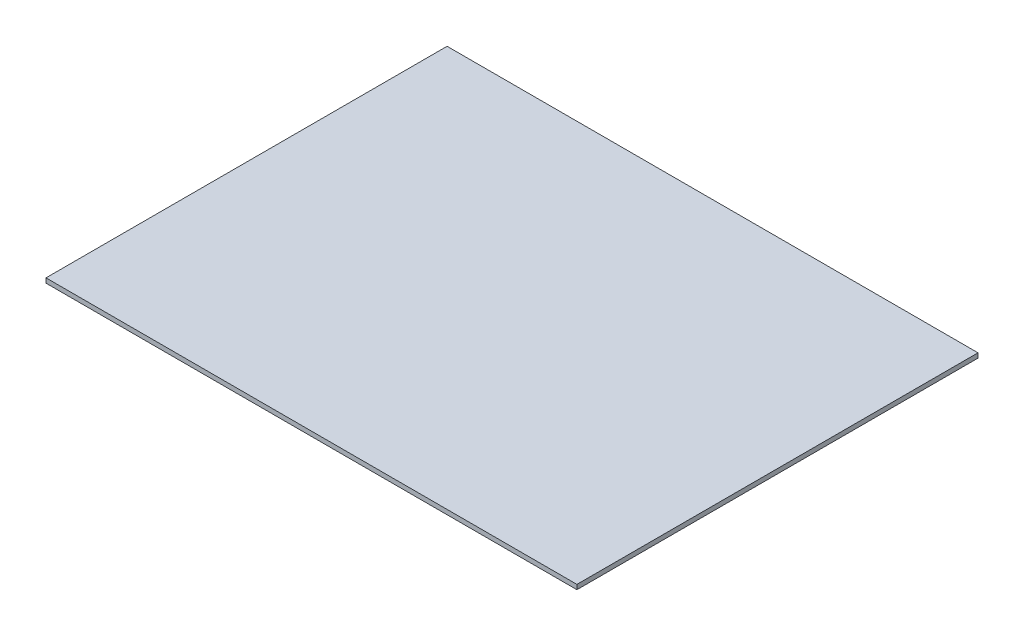
ISO-10303-21;
HEADER;
FILE_DESCRIPTION(('STEP AP214'),'2;1');
FILE_NAME('part.step','',(''),(''),'','','');
FILE_SCHEMA(('AUTOMOTIVE_DESIGN { 1 0 10303 214 1 1 1 1 }'));
ENDSEC;
DATA;
#1=APPLICATION_CONTEXT('core data for automotive mechanical design processes');
#2=APPLICATION_PROTOCOL_DEFINITION('international standard','automotive_design',2000,#1);
#3=PRODUCT_CONTEXT('',#1,'mechanical');
#4=PRODUCT('Part','Part','',(#3));
#5=PRODUCT_RELATED_PRODUCT_CATEGORY('part','',(#4));
#6=PRODUCT_DEFINITION_FORMATION('','',#4);
#7=PRODUCT_DEFINITION_CONTEXT('part definition',#1,'design');
#8=PRODUCT_DEFINITION('design','',#6,#7);
#9=PRODUCT_DEFINITION_SHAPE('','',#8);
#10=(LENGTH_UNIT() NAMED_UNIT(*) SI_UNIT(.MILLI.,.METRE.));
#11=(NAMED_UNIT(*) PLANE_ANGLE_UNIT() SI_UNIT($,.RADIAN.));
#12=(NAMED_UNIT(*) SI_UNIT($,.STERADIAN.) SOLID_ANGLE_UNIT());
#13=UNCERTAINTY_MEASURE_WITH_UNIT(LENGTH_MEASURE(1.E-05),#10,'distance_accuracy_value','');
#14=(GEOMETRIC_REPRESENTATION_CONTEXT(3) GLOBAL_UNCERTAINTY_ASSIGNED_CONTEXT((#13)) GLOBAL_UNIT_ASSIGNED_CONTEXT((#10,
#11,#12)) REPRESENTATION_CONTEXT('',''));
#15=CARTESIAN_POINT('',(0.,0.,0.));
#16=DIRECTION('',(0.,0.,1.));
#17=DIRECTION('',(1.,0.,0.));
#18=AXIS2_PLACEMENT_3D('',#15,#16,#17);
#19=CARTESIAN_POINT('',(0.,2.,0.));
#20=DIRECTION('',(1.,0.,0.));
#21=DIRECTION('',(0.,0.,-1.));
#22=AXIS2_PLACEMENT_3D('',#19,#20,#21);
#23=PLANE('',#22);
#24=DIRECTION('',(0.,0.,1.));
#25=VECTOR('',#24,1.);
#26=CARTESIAN_POINT('',(0.,0.,0.));
#27=LINE('',#26,#25);
#28=CARTESIAN_POINT('',(0.,0.,-173.));
#29=VERTEX_POINT('',#28);
#30=CARTESIAN_POINT('',(0.,0.,0.));
#31=VERTEX_POINT('',#30);
#32=EDGE_CURVE('E107',#29,#31,#27,.T.);
#33=ORIENTED_EDGE('',*,*,#32,.T.);
#34=DIRECTION('',(0.,-1.,0.));
#35=VECTOR('',#34,1.);
#36=CARTESIAN_POINT('',(0.,2.,0.));
#37=LINE('',#36,#35);
#38=CARTESIAN_POINT('',(0.,2.,0.));
#39=VERTEX_POINT('',#38);
#40=EDGE_CURVE('E11',#39,#31,#37,.T.);
#41=ORIENTED_EDGE('',*,*,#40,.F.);
#42=DIRECTION('',(0.,0.,1.));
#43=VECTOR('',#42,1.);
#44=CARTESIAN_POINT('',(0.,2.,0.));
#45=LINE('',#44,#43);
#46=CARTESIAN_POINT('',(0.,2.,-173.));
#47=VERTEX_POINT('',#46);
#48=EDGE_CURVE('E91',#47,#39,#45,.T.);
#49=ORIENTED_EDGE('',*,*,#48,.F.);
#50=DIRECTION('',(0.,-1.,0.));
#51=VECTOR('',#50,1.);
#52=CARTESIAN_POINT('',(0.,2.,-173.));
#53=LINE('',#52,#51);
#54=EDGE_CURVE('E103',#47,#29,#53,.T.);
#55=ORIENTED_EDGE('',*,*,#54,.T.);
#56=EDGE_LOOP('',(#33,#41,#49,#55));
#57=FACE_BOUND('',#56,.T.);
#58=ADVANCED_FACE('F39',(#57),#23,.F.);
#59=CARTESIAN_POINT('',(0.,2.,0.));
#60=DIRECTION('',(0.,0.,-1.));
#61=DIRECTION('',(-1.,0.,0.));
#62=AXIS2_PLACEMENT_3D('',#59,#60,#61);
#63=PLANE('',#62);
#64=DIRECTION('',(1.,0.,0.));
#65=VECTOR('',#64,1.);
#66=CARTESIAN_POINT('',(0.,0.,0.));
#67=LINE('',#66,#65);
#68=CARTESIAN_POINT('',(229.,0.,0.));
#69=VERTEX_POINT('',#68);
#70=EDGE_CURVE('E96',#31,#69,#67,.T.);
#71=ORIENTED_EDGE('',*,*,#70,.T.);
#72=DIRECTION('',(0.,-1.,0.));
#73=VECTOR('',#72,1.);
#74=CARTESIAN_POINT('',(229.,2.,0.));
#75=LINE('',#74,#73);
#76=CARTESIAN_POINT('',(229.,2.,0.));
#77=VERTEX_POINT('',#76);
#78=EDGE_CURVE('E48',#77,#69,#75,.T.);
#79=ORIENTED_EDGE('',*,*,#78,.F.);
#80=DIRECTION('',(1.,0.,0.));
#81=VECTOR('',#80,1.);
#82=CARTESIAN_POINT('',(0.,2.,0.));
#83=LINE('',#82,#81);
#84=EDGE_CURVE('E86',#39,#77,#83,.T.);
#85=ORIENTED_EDGE('',*,*,#84,.F.);
#86=ORIENTED_EDGE('',*,*,#40,.T.);
#87=EDGE_LOOP('',(#71,#79,#85,#86));
#88=FACE_BOUND('',#87,.T.);
#89=ADVANCED_FACE('F95',(#88),#63,.F.);
#90=CARTESIAN_POINT('',(229.,2.,0.));
#91=DIRECTION('',(-1.,0.,0.));
#92=DIRECTION('',(0.,0.,1.));
#93=AXIS2_PLACEMENT_3D('',#90,#91,#92);
#94=PLANE('',#93);
#95=DIRECTION('',(0.,0.,-1.));
#96=VECTOR('',#95,1.);
#97=CARTESIAN_POINT('',(229.,0.,0.));
#98=LINE('',#97,#96);
#99=CARTESIAN_POINT('',(229.,0.,-173.));
#100=VERTEX_POINT('',#99);
#101=EDGE_CURVE('E73',#69,#100,#98,.T.);
#102=ORIENTED_EDGE('',*,*,#101,.T.);
#103=DIRECTION('',(0.,-1.,0.));
#104=VECTOR('',#103,1.);
#105=CARTESIAN_POINT('',(229.,2.,-173.));
#106=LINE('',#105,#104);
#107=CARTESIAN_POINT('',(229.,2.,-173.));
#108=VERTEX_POINT('',#107);
#109=EDGE_CURVE('E98',#108,#100,#106,.T.);
#110=ORIENTED_EDGE('',*,*,#109,.F.);
#111=DIRECTION('',(0.,0.,-1.));
#112=VECTOR('',#111,1.);
#113=CARTESIAN_POINT('',(229.,2.,0.));
#114=LINE('',#113,#112);
#115=EDGE_CURVE('E89',#77,#108,#114,.T.);
#116=ORIENTED_EDGE('',*,*,#115,.F.);
#117=ORIENTED_EDGE('',*,*,#78,.T.);
#118=EDGE_LOOP('',(#102,#110,#116,#117));
#119=FACE_BOUND('',#118,.T.);
#120=ADVANCED_FACE('F99',(#119),#94,.F.);
#121=CARTESIAN_POINT('',(0.,2.,-173.));
#122=DIRECTION('',(0.,0.,1.));
#123=DIRECTION('',(1.,0.,0.));
#124=AXIS2_PLACEMENT_3D('',#121,#122,#123);
#125=PLANE('',#124);
#126=DIRECTION('',(-1.,0.,0.));
#127=VECTOR('',#126,1.);
#128=CARTESIAN_POINT('',(0.,0.,-173.));
#129=LINE('',#128,#127);
#130=EDGE_CURVE('E79',#100,#29,#129,.T.);
#131=ORIENTED_EDGE('',*,*,#130,.T.);
#132=ORIENTED_EDGE('',*,*,#54,.F.);
#133=DIRECTION('',(-1.,0.,0.));
#134=VECTOR('',#133,1.);
#135=CARTESIAN_POINT('',(0.,2.,-173.));
#136=LINE('',#135,#134);
#137=EDGE_CURVE('E56',#108,#47,#136,.T.);
#138=ORIENTED_EDGE('',*,*,#137,.F.);
#139=ORIENTED_EDGE('',*,*,#109,.T.);
#140=EDGE_LOOP('',(#131,#132,#138,#139));
#141=FACE_BOUND('',#140,.T.);
#142=ADVANCED_FACE('F120',(#141),#125,.F.);
#143=CARTESIAN_POINT('',(0.,2.,0.));
#144=DIRECTION('',(0.,-1.,0.));
#145=DIRECTION('',(0.,0.,-1.));
#146=AXIS2_PLACEMENT_3D('',#143,#144,#145);
#147=PLANE('',#146);
#148=ORIENTED_EDGE('',*,*,#48,.T.);
#149=ORIENTED_EDGE('',*,*,#84,.T.);
#150=ORIENTED_EDGE('',*,*,#115,.T.);
#151=ORIENTED_EDGE('',*,*,#137,.T.);
#152=EDGE_LOOP('',(#148,#149,#150,#151));
#153=FACE_BOUND('',#152,.T.);
#154=ADVANCED_FACE('F87',(#153),#147,.F.);
#155=CARTESIAN_POINT('',(0.,0.,0.));
#156=DIRECTION('',(0.,-1.,0.));
#157=DIRECTION('',(0.,0.,-1.));
#158=AXIS2_PLACEMENT_3D('',#155,#156,#157);
#159=PLANE('',#158);
#160=ORIENTED_EDGE('',*,*,#32,.F.);
#161=ORIENTED_EDGE('',*,*,#130,.F.);
#162=ORIENTED_EDGE('',*,*,#101,.F.);
#163=ORIENTED_EDGE('',*,*,#70,.F.);
#164=EDGE_LOOP('',(#160,#161,#162,#163));
#165=FACE_BOUND('',#164,.T.);
#166=ADVANCED_FACE('F123',(#165),#159,.T.);
#167=CLOSED_SHELL('',(#58,#89,#120,#142,#154,#166));
#168=MANIFOLD_SOLID_BREP('B2',#167);
#169=ADVANCED_BREP_SHAPE_REPRESENTATION('',(#18,#168),#14);
#170=SHAPE_DEFINITION_REPRESENTATION(#9,#169);
ENDSEC;
END-ISO-10303-21;
